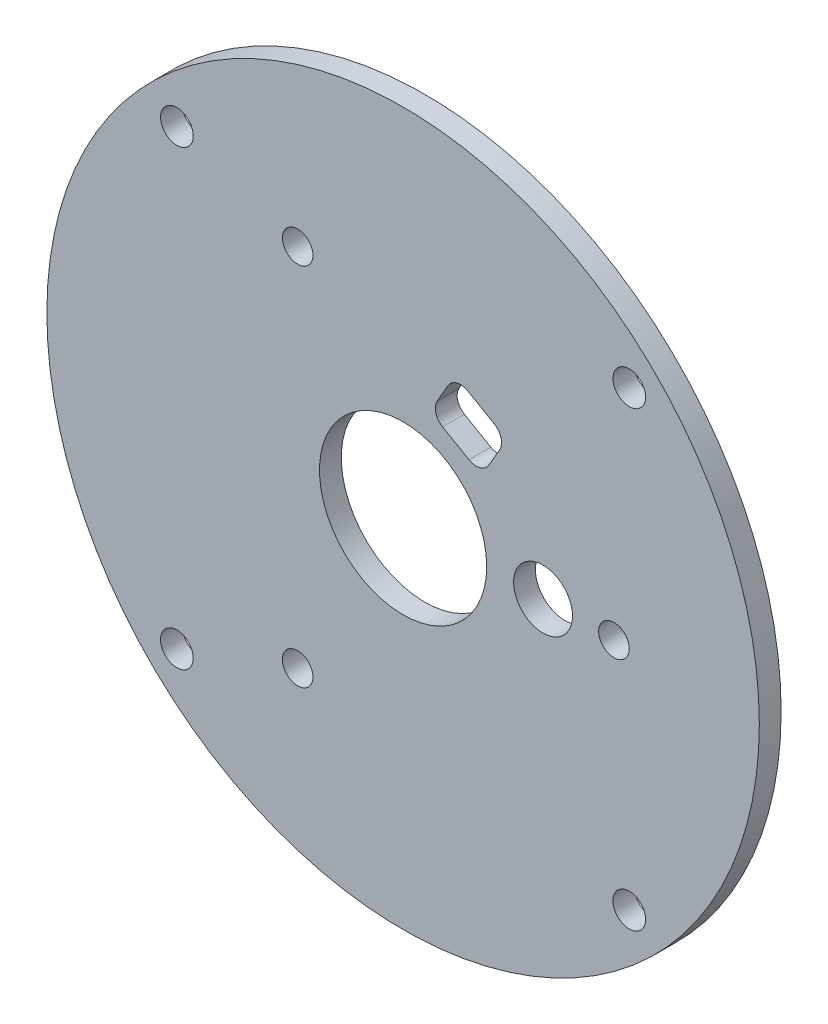
ISO-10303-21;
HEADER;
FILE_DESCRIPTION(('STEP AP214'),'2;1');
FILE_NAME('part.step','',(''),(''),'','','');
FILE_SCHEMA(('AUTOMOTIVE_DESIGN { 1 0 10303 214 1 1 1 1 }'));
ENDSEC;
DATA;
#1=APPLICATION_CONTEXT('core data for automotive mechanical design processes');
#2=APPLICATION_PROTOCOL_DEFINITION('international standard','automotive_design',2000,#1);
#3=PRODUCT_CONTEXT('',#1,'mechanical');
#4=PRODUCT('Part','Part','',(#3));
#5=PRODUCT_RELATED_PRODUCT_CATEGORY('part','',(#4));
#6=PRODUCT_DEFINITION_FORMATION('','',#4);
#7=PRODUCT_DEFINITION_CONTEXT('part definition',#1,'design');
#8=PRODUCT_DEFINITION('design','',#6,#7);
#9=PRODUCT_DEFINITION_SHAPE('','',#8);
#10=(LENGTH_UNIT() NAMED_UNIT(*) SI_UNIT(.MILLI.,.METRE.));
#11=(NAMED_UNIT(*) PLANE_ANGLE_UNIT() SI_UNIT($,.RADIAN.));
#12=(NAMED_UNIT(*) SI_UNIT($,.STERADIAN.) SOLID_ANGLE_UNIT());
#13=UNCERTAINTY_MEASURE_WITH_UNIT(LENGTH_MEASURE(1.E-05),#10,'distance_accuracy_value','');
#14=(GEOMETRIC_REPRESENTATION_CONTEXT(3) GLOBAL_UNCERTAINTY_ASSIGNED_CONTEXT((#13)) GLOBAL_UNIT_ASSIGNED_CONTEXT((#10,
#11,#12)) REPRESENTATION_CONTEXT('',''));
#15=CARTESIAN_POINT('',(0.,0.,0.));
#16=DIRECTION('',(0.,0.,1.));
#17=DIRECTION('',(1.,0.,0.));
#18=AXIS2_PLACEMENT_3D('',#15,#16,#17);
#19=CARTESIAN_POINT('',(0.,0.,3.));
#20=DIRECTION('',(0.,0.,-1.));
#21=DIRECTION('',(-1.,0.,0.));
#22=AXIS2_PLACEMENT_3D('',#19,#20,#21);
#23=CYLINDRICAL_SURFACE('',#22,49.);
#24=CARTESIAN_POINT('',(0.,0.,3.));
#25=DIRECTION('',(0.,0.,1.));
#26=DIRECTION('',(1.,0.,0.));
#27=AXIS2_PLACEMENT_3D('',#24,#25,#26);
#28=CIRCLE('',#27,49.);
#29=CARTESIAN_POINT('',(49.,0.,3.));
#30=VERTEX_POINT('',#29);
#31=EDGE_CURVE('E114',#30,#30,#28,.T.);
#32=ORIENTED_EDGE('',*,*,#31,.F.);
#33=EDGE_LOOP('',(#32));
#34=FACE_BOUND('',#33,.T.);
#35=CARTESIAN_POINT('',(0.,0.,0.));
#36=DIRECTION('',(0.,0.,1.));
#37=DIRECTION('',(1.,0.,0.));
#38=AXIS2_PLACEMENT_3D('',#35,#36,#37);
#39=CIRCLE('',#38,49.);
#40=CARTESIAN_POINT('',(49.,0.,0.));
#41=VERTEX_POINT('',#40);
#42=EDGE_CURVE('E175',#41,#41,#39,.T.);
#43=ORIENTED_EDGE('',*,*,#42,.T.);
#44=EDGE_LOOP('',(#43));
#45=FACE_BOUND('',#44,.T.);
#46=ADVANCED_FACE('F36',(#34,#45),#23,.T.);
#47=CARTESIAN_POINT('',(0.,0.,3.));
#48=DIRECTION('',(0.,0.,1.));
#49=DIRECTION('',(1.,0.,0.));
#50=AXIS2_PLACEMENT_3D('',#47,#48,#49);
#51=PLANE('',#50);
#52=CARTESIAN_POINT('',(-31.1126983722071,-31.1126983722073,3.));
#53=DIRECTION('',(0.,0.,1.));
#54=DIRECTION('',(1.,0.,0.));
#55=AXIS2_PLACEMENT_3D('',#52,#53,#54);
#56=CIRCLE('',#55,2.25);
#57=CARTESIAN_POINT('',(-28.8626983722072,-31.1126983722073,3.));
#58=VERTEX_POINT('',#57);
#59=EDGE_CURVE('E228',#58,#58,#56,.T.);
#60=ORIENTED_EDGE('',*,*,#59,.F.);
#61=EDGE_LOOP('',(#60));
#62=FACE_BOUND('',#61,.T.);
#63=CARTESIAN_POINT('',(31.1126983722072,-31.1126983722073,3.));
#64=DIRECTION('',(0.,0.,1.));
#65=DIRECTION('',(1.,0.,0.));
#66=AXIS2_PLACEMENT_3D('',#63,#64,#65);
#67=CIRCLE('',#66,2.25000000000001);
#68=CARTESIAN_POINT('',(33.3626983722072,-31.1126983722073,3.));
#69=VERTEX_POINT('',#68);
#70=EDGE_CURVE('E227',#69,#69,#67,.T.);
#71=ORIENTED_EDGE('',*,*,#70,.F.);
#72=EDGE_LOOP('',(#71));
#73=FACE_BOUND('',#72,.T.);
#74=CARTESIAN_POINT('',(31.1126983722071,31.1126983722073,3.));
#75=DIRECTION('',(0.,0.,1.));
#76=DIRECTION('',(1.,0.,0.));
#77=AXIS2_PLACEMENT_3D('',#74,#75,#76);
#78=CIRCLE('',#77,2.25);
#79=CARTESIAN_POINT('',(33.3626983722071,31.1126983722073,3.));
#80=VERTEX_POINT('',#79);
#81=EDGE_CURVE('E234',#80,#80,#78,.T.);
#82=ORIENTED_EDGE('',*,*,#81,.F.);
#83=EDGE_LOOP('',(#82));
#84=FACE_BOUND('',#83,.T.);
#85=CARTESIAN_POINT('',(-31.1126983722072,31.1126983722073,3.));
#86=DIRECTION('',(0.,0.,1.));
#87=DIRECTION('',(1.,0.,0.));
#88=AXIS2_PLACEMENT_3D('',#85,#86,#87);
#89=CIRCLE('',#88,2.25);
#90=CARTESIAN_POINT('',(-28.8626983722072,31.1126983722073,3.));
#91=VERTEX_POINT('',#90);
#92=EDGE_CURVE('E220',#91,#91,#89,.T.);
#93=ORIENTED_EDGE('',*,*,#92,.F.);
#94=EDGE_LOOP('',(#93));
#95=FACE_BOUND('',#94,.T.);
#96=CARTESIAN_POINT('',(0.,0.,3.));
#97=DIRECTION('',(0.,0.,1.));
#98=DIRECTION('',(1.,0.,0.));
#99=AXIS2_PLACEMENT_3D('',#96,#97,#98);
#100=CIRCLE('',#99,11.5);
#101=CARTESIAN_POINT('',(11.5,0.,3.));
#102=VERTEX_POINT('',#101);
#103=EDGE_CURVE('E168',#102,#102,#100,.F.);
#104=ORIENTED_EDGE('',*,*,#103,.T.);
#105=EDGE_LOOP('',(#104));
#106=FACE_BOUND('',#105,.T.);
#107=DIRECTION('',(-0.500123267776996,-0.865954223402172,0.));
#108=VECTOR('',#107,1.);
#109=CARTESIAN_POINT('',(-3.55041231594891,2.05050539788568,3.));
#110=LINE('',#109,#108);
#111=CARTESIAN_POINT('',(6.17141129111391,18.8836638492554,3.));
#112=VERTEX_POINT('',#111);
#113=CARTESIAN_POINT('',(4.70162160237152,16.3387500840215,3.));
#114=VERTEX_POINT('',#113);
#115=EDGE_CURVE('E204',#112,#114,#110,.T.);
#116=ORIENTED_EDGE('',*,*,#115,.F.);
#117=CARTESIAN_POINT('',(7.90331973791826,17.8834173137014,3.));
#118=DIRECTION('',(0.,0.,1.));
#119=DIRECTION('',(1.,0.,0.));
#120=AXIS2_PLACEMENT_3D('',#117,#118,#119);
#121=CIRCLE('',#120,2.);
#122=CARTESIAN_POINT('',(8.90356627347225,19.6153257605058,3.));
#123=VERTEX_POINT('',#122);
#124=EDGE_CURVE('E122',#112,#123,#121,.F.);
#125=ORIENTED_EDGE('',*,*,#124,.T.);
#126=DIRECTION('',(-0.865954223402173,0.500123267776995,0.));
#127=VECTOR('',#126,1.);
#128=CARTESIAN_POINT('',(10.7220701426168,18.5650668981741,3.));
#129=LINE('',#128,#127);
#130=CARTESIAN_POINT('',(12.5405740117614,17.5148080358424,3.));
#131=VERTEX_POINT('',#130);
#132=EDGE_CURVE('E107',#131,#123,#129,.T.);
#133=ORIENTED_EDGE('',*,*,#132,.F.);
#134=CARTESIAN_POINT('',(11.5403274762074,15.7828995890381,3.));
#135=DIRECTION('',(0.,0.,1.));
#136=DIRECTION('',(1.,0.,0.));
#137=AXIS2_PLACEMENT_3D('',#134,#135,#136);
#138=CIRCLE('',#137,2.);
#139=CARTESIAN_POINT('',(13.2722359230117,14.7826530534841,3.));
#140=VERTEX_POINT('',#139);
#141=EDGE_CURVE('E119',#131,#140,#138,.F.);
#142=ORIENTED_EDGE('',*,*,#141,.T.);
#143=DIRECTION('',(-0.500123267776995,-0.865954223402173,0.));
#144=VECTOR('',#143,1.);
#145=CARTESIAN_POINT('',(3.55041231594891,-2.05050539788568,3.));
#146=LINE('',#145,#144);
#147=CARTESIAN_POINT('',(11.8024462342693,12.2377392882502,3.));
#148=VERTEX_POINT('',#147);
#149=EDGE_CURVE('E123',#140,#148,#146,.T.);
#150=ORIENTED_EDGE('',*,*,#149,.T.);
#151=CARTESIAN_POINT('',(10.070537787465,13.2379858238042,3.));
#152=DIRECTION('',(0.,0.,1.));
#153=DIRECTION('',(1.,0.,0.));
#154=AXIS2_PLACEMENT_3D('',#151,#152,#153);
#155=CIRCLE('',#154,2.);
#156=CARTESIAN_POINT('',(9.070291251911,11.5060773769998,3.));
#157=VERTEX_POINT('',#156);
#158=EDGE_CURVE('E58',#148,#157,#155,.F.);
#159=ORIENTED_EDGE('',*,*,#158,.T.);
#160=DIRECTION('',(-0.865954223402173,0.500123267776995,0.));
#161=VECTOR('',#160,1.);
#162=CARTESIAN_POINT('',(7.25178738276643,12.5563362393315,3.));
#163=LINE('',#162,#161);
#164=CARTESIAN_POINT('',(5.43328351362187,13.6065951016632,3.));
#165=VERTEX_POINT('',#164);
#166=EDGE_CURVE('E206',#157,#165,#163,.T.);
#167=ORIENTED_EDGE('',*,*,#166,.T.);
#168=CARTESIAN_POINT('',(6.43353004917586,15.3385035484675,3.));
#169=DIRECTION('',(0.,0.,1.));
#170=DIRECTION('',(1.,0.,0.));
#171=AXIS2_PLACEMENT_3D('',#168,#169,#170);
#172=CIRCLE('',#171,2.);
#173=EDGE_CURVE('E11',#165,#114,#172,.F.);
#174=ORIENTED_EDGE('',*,*,#173,.T.);
#175=EDGE_LOOP('',(#116,#125,#133,#142,#150,#159,#167,#174));
#176=FACE_BOUND('',#175,.T.);
#177=CARTESIAN_POINT('',(19.25,0.,3.));
#178=DIRECTION('',(0.,0.,1.));
#179=DIRECTION('',(1.,0.,0.));
#180=AXIS2_PLACEMENT_3D('',#177,#178,#179);
#181=CIRCLE('',#180,4.05);
#182=CARTESIAN_POINT('',(23.3,0.,3.));
#183=VERTEX_POINT('',#182);
#184=EDGE_CURVE('E196',#183,#183,#181,.F.);
#185=ORIENTED_EDGE('',*,*,#184,.T.);
#186=EDGE_LOOP('',(#185));
#187=FACE_BOUND('',#186,.T.);
#188=CARTESIAN_POINT('',(-14.5000000000001,25.1147367097487,3.));
#189=DIRECTION('',(0.,0.,1.));
#190=DIRECTION('',(1.,0.,0.));
#191=AXIS2_PLACEMENT_3D('',#188,#189,#190);
#192=CIRCLE('',#191,2.1);
#193=CARTESIAN_POINT('',(-12.4000000000001,25.1147367097487,3.));
#194=VERTEX_POINT('',#193);
#195=EDGE_CURVE('E186',#194,#194,#192,.F.);
#196=ORIENTED_EDGE('',*,*,#195,.T.);
#197=EDGE_LOOP('',(#196));
#198=FACE_BOUND('',#197,.T.);
#199=CARTESIAN_POINT('',(29.,0.,3.));
#200=DIRECTION('',(0.,0.,1.));
#201=DIRECTION('',(1.,0.,0.));
#202=AXIS2_PLACEMENT_3D('',#199,#200,#201);
#203=CIRCLE('',#202,2.1);
#204=CARTESIAN_POINT('',(31.1,0.,3.));
#205=VERTEX_POINT('',#204);
#206=EDGE_CURVE('E183',#205,#205,#203,.F.);
#207=ORIENTED_EDGE('',*,*,#206,.T.);
#208=EDGE_LOOP('',(#207));
#209=FACE_BOUND('',#208,.T.);
#210=CARTESIAN_POINT('',(-14.5,-25.1147367097487,3.));
#211=DIRECTION('',(0.,0.,1.));
#212=DIRECTION('',(1.,0.,0.));
#213=AXIS2_PLACEMENT_3D('',#210,#211,#212);
#214=CIRCLE('',#213,2.1);
#215=CARTESIAN_POINT('',(-12.4,-25.1147367097487,3.));
#216=VERTEX_POINT('',#215);
#217=EDGE_CURVE('E178',#216,#216,#214,.F.);
#218=ORIENTED_EDGE('',*,*,#217,.T.);
#219=EDGE_LOOP('',(#218));
#220=FACE_BOUND('',#219,.T.);
#221=ORIENTED_EDGE('',*,*,#31,.T.);
#222=EDGE_LOOP('',(#221));
#223=FACE_BOUND('',#222,.T.);
#224=ADVANCED_FACE('F117',(#62,#73,#84,#95,#106,#176,#187,#198,#209,#220,#223),#51,.T.);
#225=CARTESIAN_POINT('',(0.,44.,0.));
#226=DIRECTION('',(0.,0.,1.));
#227=DIRECTION('',(1.,0.,0.));
#228=AXIS2_PLACEMENT_3D('',#225,#226,#227);
#229=PLANE('',#228);
#230=CARTESIAN_POINT('',(-31.1126983722071,-31.1126983722073,0.));
#231=DIRECTION('',(0.,0.,1.));
#232=DIRECTION('',(1.,0.,0.));
#233=AXIS2_PLACEMENT_3D('',#230,#231,#232);
#234=CIRCLE('',#233,2.25);
#235=CARTESIAN_POINT('',(-28.8626983722072,-31.1126983722073,0.));
#236=VERTEX_POINT('',#235);
#237=EDGE_CURVE('E224',#236,#236,#234,.F.);
#238=ORIENTED_EDGE('',*,*,#237,.F.);
#239=EDGE_LOOP('',(#238));
#240=FACE_BOUND('',#239,.T.);
#241=CARTESIAN_POINT('',(31.1126983722072,-31.1126983722073,0.));
#242=DIRECTION('',(0.,0.,1.));
#243=DIRECTION('',(1.,0.,0.));
#244=AXIS2_PLACEMENT_3D('',#241,#242,#243);
#245=CIRCLE('',#244,2.25000000000001);
#246=CARTESIAN_POINT('',(33.3626983722072,-31.1126983722073,0.));
#247=VERTEX_POINT('',#246);
#248=EDGE_CURVE('E231',#247,#247,#245,.F.);
#249=ORIENTED_EDGE('',*,*,#248,.F.);
#250=EDGE_LOOP('',(#249));
#251=FACE_BOUND('',#250,.T.);
#252=CARTESIAN_POINT('',(31.1126983722071,31.1126983722073,0.));
#253=DIRECTION('',(0.,0.,1.));
#254=DIRECTION('',(1.,0.,0.));
#255=AXIS2_PLACEMENT_3D('',#252,#253,#254);
#256=CIRCLE('',#255,2.25);
#257=CARTESIAN_POINT('',(33.3626983722071,31.1126983722073,0.));
#258=VERTEX_POINT('',#257);
#259=EDGE_CURVE('E223',#258,#258,#256,.F.);
#260=ORIENTED_EDGE('',*,*,#259,.F.);
#261=EDGE_LOOP('',(#260));
#262=FACE_BOUND('',#261,.T.);
#263=CARTESIAN_POINT('',(-31.1126983722072,31.1126983722073,0.));
#264=DIRECTION('',(0.,0.,1.));
#265=DIRECTION('',(1.,0.,0.));
#266=AXIS2_PLACEMENT_3D('',#263,#264,#265);
#267=CIRCLE('',#266,2.25);
#268=CARTESIAN_POINT('',(-28.8626983722072,31.1126983722073,0.));
#269=VERTEX_POINT('',#268);
#270=EDGE_CURVE('E217',#269,#269,#267,.F.);
#271=ORIENTED_EDGE('',*,*,#270,.F.);
#272=EDGE_LOOP('',(#271));
#273=FACE_BOUND('',#272,.T.);
#274=CARTESIAN_POINT('',(0.,0.,0.));
#275=DIRECTION('',(0.,0.,1.));
#276=DIRECTION('',(1.,0.,0.));
#277=AXIS2_PLACEMENT_3D('',#274,#275,#276);
#278=CIRCLE('',#277,11.5);
#279=CARTESIAN_POINT('',(11.5,0.,0.));
#280=VERTEX_POINT('',#279);
#281=EDGE_CURVE('E214',#280,#280,#278,.T.);
#282=ORIENTED_EDGE('',*,*,#281,.T.);
#283=EDGE_LOOP('',(#282));
#284=FACE_BOUND('',#283,.T.);
#285=DIRECTION('',(0.865954223402173,-0.500123267776995,0.));
#286=VECTOR('',#285,1.);
#287=CARTESIAN_POINT('',(7.1716578266679,20.6155722960598,0.));
#288=LINE('',#287,#286);
#289=CARTESIAN_POINT('',(8.90356627347225,19.6153257605058,0.));
#290=VERTEX_POINT('',#289);
#291=CARTESIAN_POINT('',(12.5405740117614,17.5148080358424,0.));
#292=VERTEX_POINT('',#291);
#293=EDGE_CURVE('E110',#290,#292,#288,.T.);
#294=ORIENTED_EDGE('',*,*,#293,.F.);
#295=CARTESIAN_POINT('',(7.90331973791826,17.8834173137014,0.));
#296=DIRECTION('',(0.,0.,1.));
#297=DIRECTION('',(1.,0.,0.));
#298=AXIS2_PLACEMENT_3D('',#295,#296,#297);
#299=CIRCLE('',#298,2.);
#300=CARTESIAN_POINT('',(6.17141129111391,18.8836638492554,0.));
#301=VERTEX_POINT('',#300);
#302=EDGE_CURVE('E155',#290,#301,#299,.T.);
#303=ORIENTED_EDGE('',*,*,#302,.T.);
#304=DIRECTION('',(0.500123267776996,0.865954223402172,0.));
#305=VECTOR('',#304,1.);
#306=CARTESIAN_POINT('',(3.70137506681753,14.6068416372172,0.));
#307=LINE('',#306,#305);
#308=CARTESIAN_POINT('',(4.70162160237152,16.3387500840215,0.));
#309=VERTEX_POINT('',#308);
#310=EDGE_CURVE('E143',#309,#301,#307,.T.);
#311=ORIENTED_EDGE('',*,*,#310,.F.);
#312=CARTESIAN_POINT('',(6.43353004917586,15.3385035484675,0.));
#313=DIRECTION('',(0.,0.,1.));
#314=DIRECTION('',(1.,0.,0.));
#315=AXIS2_PLACEMENT_3D('',#312,#313,#314);
#316=CIRCLE('',#315,2.);
#317=CARTESIAN_POINT('',(5.43328351362187,13.6065951016632,0.));
#318=VERTEX_POINT('',#317);
#319=EDGE_CURVE('E44',#309,#318,#316,.T.);
#320=ORIENTED_EDGE('',*,*,#319,.T.);
#321=DIRECTION('',(0.865954223402172,-0.500123267776995,0.));
#322=VECTOR('',#321,1.);
#323=CARTESIAN_POINT('',(3.70137506681753,14.6068416372172,0.));
#324=LINE('',#323,#322);
#325=CARTESIAN_POINT('',(9.070291251911,11.5060773769998,0.));
#326=VERTEX_POINT('',#325);
#327=EDGE_CURVE('E124',#318,#326,#324,.T.);
#328=ORIENTED_EDGE('',*,*,#327,.T.);
#329=CARTESIAN_POINT('',(10.070537787465,13.2379858238042,0.));
#330=DIRECTION('',(0.,0.,1.));
#331=DIRECTION('',(1.,0.,0.));
#332=AXIS2_PLACEMENT_3D('',#329,#330,#331);
#333=CIRCLE('',#332,2.);
#334=CARTESIAN_POINT('',(11.8024462342693,12.2377392882502,0.));
#335=VERTEX_POINT('',#334);
#336=EDGE_CURVE('E130',#326,#335,#333,.T.);
#337=ORIENTED_EDGE('',*,*,#336,.T.);
#338=DIRECTION('',(0.500123267776995,0.865954223402173,0.));
#339=VECTOR('',#338,1.);
#340=CARTESIAN_POINT('',(10.8021996987153,10.5058308414458,0.));
#341=LINE('',#340,#339);
#342=CARTESIAN_POINT('',(13.2722359230117,14.7826530534841,0.));
#343=VERTEX_POINT('',#342);
#344=EDGE_CURVE('E151',#335,#343,#341,.T.);
#345=ORIENTED_EDGE('',*,*,#344,.T.);
#346=CARTESIAN_POINT('',(11.5403274762074,15.7828995890381,0.));
#347=DIRECTION('',(0.,0.,1.));
#348=DIRECTION('',(1.,0.,0.));
#349=AXIS2_PLACEMENT_3D('',#346,#347,#348);
#350=CIRCLE('',#349,2.);
#351=EDGE_CURVE('E131',#343,#292,#350,.T.);
#352=ORIENTED_EDGE('',*,*,#351,.T.);
#353=EDGE_LOOP('',(#294,#303,#311,#320,#328,#337,#345,#352));
#354=FACE_BOUND('',#353,.T.);
#355=CARTESIAN_POINT('',(19.25,0.,0.));
#356=DIRECTION('',(0.,0.,1.));
#357=DIRECTION('',(1.,0.,0.));
#358=AXIS2_PLACEMENT_3D('',#355,#356,#357);
#359=CIRCLE('',#358,4.05);
#360=CARTESIAN_POINT('',(23.3,0.,0.));
#361=VERTEX_POINT('',#360);
#362=EDGE_CURVE('E201',#361,#361,#359,.T.);
#363=ORIENTED_EDGE('',*,*,#362,.T.);
#364=EDGE_LOOP('',(#363));
#365=FACE_BOUND('',#364,.T.);
#366=CARTESIAN_POINT('',(29.,0.,0.));
#367=DIRECTION('',(0.,0.,1.));
#368=DIRECTION('',(1.,0.,0.));
#369=AXIS2_PLACEMENT_3D('',#366,#367,#368);
#370=CIRCLE('',#369,2.1);
#371=CARTESIAN_POINT('',(31.1,0.,0.));
#372=VERTEX_POINT('',#371);
#373=EDGE_CURVE('E193',#372,#372,#370,.T.);
#374=ORIENTED_EDGE('',*,*,#373,.T.);
#375=EDGE_LOOP('',(#374));
#376=FACE_BOUND('',#375,.T.);
#377=CARTESIAN_POINT('',(-14.5,-25.1147367097487,0.));
#378=DIRECTION('',(0.,0.,1.));
#379=DIRECTION('',(1.,0.,0.));
#380=AXIS2_PLACEMENT_3D('',#377,#378,#379);
#381=CIRCLE('',#380,2.1);
#382=CARTESIAN_POINT('',(-12.4,-25.1147367097487,0.));
#383=VERTEX_POINT('',#382);
#384=EDGE_CURVE('E192',#383,#383,#381,.T.);
#385=ORIENTED_EDGE('',*,*,#384,.T.);
#386=EDGE_LOOP('',(#385));
#387=FACE_BOUND('',#386,.T.);
#388=CARTESIAN_POINT('',(-14.5000000000001,25.1147367097487,0.));
#389=DIRECTION('',(0.,0.,1.));
#390=DIRECTION('',(1.,0.,0.));
#391=AXIS2_PLACEMENT_3D('',#388,#389,#390);
#392=CIRCLE('',#391,2.1);
#393=CARTESIAN_POINT('',(-12.4000000000001,25.1147367097487,0.));
#394=VERTEX_POINT('',#393);
#395=EDGE_CURVE('E189',#394,#394,#392,.T.);
#396=ORIENTED_EDGE('',*,*,#395,.T.);
#397=EDGE_LOOP('',(#396));
#398=FACE_BOUND('',#397,.T.);
#399=ORIENTED_EDGE('',*,*,#42,.F.);
#400=EDGE_LOOP('',(#399));
#401=FACE_BOUND('',#400,.T.);
#402=ADVANCED_FACE('F140',(#240,#251,#262,#273,#284,#354,#365,#376,#387,#398,#401),#229,.F.);
#403=CARTESIAN_POINT('',(-14.5000000000001,25.1147367097487,13.));
#404=DIRECTION('',(0.,0.,-1.));
#405=DIRECTION('',(-1.,0.,0.));
#406=AXIS2_PLACEMENT_3D('',#403,#404,#405);
#407=CYLINDRICAL_SURFACE('',#406,2.1);
#408=ORIENTED_EDGE('',*,*,#195,.F.);
#409=EDGE_LOOP('',(#408));
#410=FACE_BOUND('',#409,.T.);
#411=ORIENTED_EDGE('',*,*,#395,.F.);
#412=EDGE_LOOP('',(#411));
#413=FACE_BOUND('',#412,.T.);
#414=ADVANCED_FACE('F260',(#410,#413),#407,.F.);
#415=CARTESIAN_POINT('',(-14.5,-25.1147367097487,13.));
#416=DIRECTION('',(0.,0.,-1.));
#417=DIRECTION('',(-1.,0.,0.));
#418=AXIS2_PLACEMENT_3D('',#415,#416,#417);
#419=CYLINDRICAL_SURFACE('',#418,2.1);
#420=ORIENTED_EDGE('',*,*,#217,.F.);
#421=EDGE_LOOP('',(#420));
#422=FACE_BOUND('',#421,.T.);
#423=ORIENTED_EDGE('',*,*,#384,.F.);
#424=EDGE_LOOP('',(#423));
#425=FACE_BOUND('',#424,.T.);
#426=ADVANCED_FACE('F266',(#422,#425),#419,.F.);
#427=CARTESIAN_POINT('',(29.,0.,13.));
#428=DIRECTION('',(0.,0.,-1.));
#429=DIRECTION('',(-1.,0.,0.));
#430=AXIS2_PLACEMENT_3D('',#427,#428,#429);
#431=CYLINDRICAL_SURFACE('',#430,2.1);
#432=ORIENTED_EDGE('',*,*,#206,.F.);
#433=EDGE_LOOP('',(#432));
#434=FACE_BOUND('',#433,.T.);
#435=ORIENTED_EDGE('',*,*,#373,.F.);
#436=EDGE_LOOP('',(#435));
#437=FACE_BOUND('',#436,.T.);
#438=ADVANCED_FACE('F280',(#434,#437),#431,.F.);
#439=CARTESIAN_POINT('',(19.25,0.,13.));
#440=DIRECTION('',(0.,0.,-1.));
#441=DIRECTION('',(-1.,0.,0.));
#442=AXIS2_PLACEMENT_3D('',#439,#440,#441);
#443=CYLINDRICAL_SURFACE('',#442,4.05);
#444=ORIENTED_EDGE('',*,*,#184,.F.);
#445=EDGE_LOOP('',(#444));
#446=FACE_BOUND('',#445,.T.);
#447=ORIENTED_EDGE('',*,*,#362,.F.);
#448=EDGE_LOOP('',(#447));
#449=FACE_BOUND('',#448,.T.);
#450=ADVANCED_FACE('F283',(#446,#449),#443,.F.);
#451=CARTESIAN_POINT('',(3.70137506681753,14.6068416372172,13.));
#452=DIRECTION('',(-0.865954223402173,0.500123267776996,0.));
#453=DIRECTION('',(-0.500123267776996,-0.865954223402172,0.));
#454=AXIS2_PLACEMENT_3D('',#451,#452,#453);
#455=PLANE('',#454);
#456=ORIENTED_EDGE('',*,*,#310,.T.);
#457=DIRECTION('',(0.,0.,-1.));
#458=VECTOR('',#457,1.);
#459=CARTESIAN_POINT('',(6.17141129111391,18.8836638492554,3.));
#460=LINE('',#459,#458);
#461=EDGE_CURVE('E166',#301,#112,#460,.F.);
#462=ORIENTED_EDGE('',*,*,#461,.T.);
#463=ORIENTED_EDGE('',*,*,#115,.T.);
#464=DIRECTION('',(0.,0.,-1.));
#465=VECTOR('',#464,1.);
#466=CARTESIAN_POINT('',(4.70162160237152,16.3387500840215,13.));
#467=LINE('',#466,#465);
#468=EDGE_CURVE('E167',#114,#309,#467,.T.);
#469=ORIENTED_EDGE('',*,*,#468,.T.);
#470=EDGE_LOOP('',(#456,#462,#463,#469));
#471=FACE_BOUND('',#470,.T.);
#472=ADVANCED_FACE('F164',(#471),#455,.F.);
#473=CARTESIAN_POINT('',(3.70137506681753,14.6068416372172,13.));
#474=DIRECTION('',(0.500123267776995,0.865954223402173,0.));
#475=DIRECTION('',(-0.865954223402173,0.500123267776995,0.));
#476=AXIS2_PLACEMENT_3D('',#473,#474,#475);
#477=PLANE('',#476);
#478=ORIENTED_EDGE('',*,*,#166,.F.);
#479=DIRECTION('',(0.,0.,-1.));
#480=VECTOR('',#479,1.);
#481=CARTESIAN_POINT('',(9.070291251911,11.5060773769998,0.));
#482=LINE('',#481,#480);
#483=EDGE_CURVE('E150',#157,#326,#482,.T.);
#484=ORIENTED_EDGE('',*,*,#483,.T.);
#485=ORIENTED_EDGE('',*,*,#327,.F.);
#486=DIRECTION('',(0.,0.,-1.));
#487=VECTOR('',#486,1.);
#488=CARTESIAN_POINT('',(5.43328351362187,13.6065951016632,13.));
#489=LINE('',#488,#487);
#490=EDGE_CURVE('E51',#318,#165,#489,.F.);
#491=ORIENTED_EDGE('',*,*,#490,.T.);
#492=EDGE_LOOP('',(#478,#484,#485,#491));
#493=FACE_BOUND('',#492,.T.);
#494=ADVANCED_FACE('F148',(#493),#477,.T.);
#495=CARTESIAN_POINT('',(10.8021996987153,10.5058308414458,13.));
#496=DIRECTION('',(-0.865954223402173,0.500123267776995,0.));
#497=DIRECTION('',(-0.500123267776995,-0.865954223402173,0.));
#498=AXIS2_PLACEMENT_3D('',#495,#496,#497);
#499=PLANE('',#498);
#500=ORIENTED_EDGE('',*,*,#149,.F.);
#501=DIRECTION('',(0.,0.,-1.));
#502=VECTOR('',#501,1.);
#503=CARTESIAN_POINT('',(13.2722359230117,14.7826530534841,13.));
#504=LINE('',#503,#502);
#505=EDGE_CURVE('E129',#140,#343,#504,.T.);
#506=ORIENTED_EDGE('',*,*,#505,.T.);
#507=ORIENTED_EDGE('',*,*,#344,.F.);
#508=DIRECTION('',(0.,0.,-1.));
#509=VECTOR('',#508,1.);
#510=CARTESIAN_POINT('',(11.8024462342693,12.2377392882502,3.));
#511=LINE('',#510,#509);
#512=EDGE_CURVE('E157',#335,#148,#511,.F.);
#513=ORIENTED_EDGE('',*,*,#512,.T.);
#514=EDGE_LOOP('',(#500,#506,#507,#513));
#515=FACE_BOUND('',#514,.T.);
#516=ADVANCED_FACE('F295',(#515),#499,.T.);
#517=CARTESIAN_POINT('',(7.1716578266679,20.6155722960598,13.));
#518=DIRECTION('',(0.500123267776995,0.865954223402173,0.));
#519=DIRECTION('',(-0.865954223402173,0.500123267776995,0.));
#520=AXIS2_PLACEMENT_3D('',#517,#518,#519);
#521=PLANE('',#520);
#522=ORIENTED_EDGE('',*,*,#132,.T.);
#523=DIRECTION('',(0.,0.,-1.));
#524=VECTOR('',#523,1.);
#525=CARTESIAN_POINT('',(8.90356627347225,19.6153257605058,0.));
#526=LINE('',#525,#524);
#527=EDGE_CURVE('E113',#123,#290,#526,.T.);
#528=ORIENTED_EDGE('',*,*,#527,.T.);
#529=ORIENTED_EDGE('',*,*,#293,.T.);
#530=DIRECTION('',(0.,0.,-1.));
#531=VECTOR('',#530,1.);
#532=CARTESIAN_POINT('',(12.5405740117614,17.5148080358424,13.));
#533=LINE('',#532,#531);
#534=EDGE_CURVE('E103',#292,#131,#533,.F.);
#535=ORIENTED_EDGE('',*,*,#534,.T.);
#536=EDGE_LOOP('',(#522,#528,#529,#535));
#537=FACE_BOUND('',#536,.T.);
#538=ADVANCED_FACE('F105',(#537),#521,.F.);
#539=CARTESIAN_POINT('',(0.,0.,13.));
#540=DIRECTION('',(0.,0.,-1.));
#541=DIRECTION('',(-1.,0.,0.));
#542=AXIS2_PLACEMENT_3D('',#539,#540,#541);
#543=CYLINDRICAL_SURFACE('',#542,11.5);
#544=ORIENTED_EDGE('',*,*,#103,.F.);
#545=EDGE_LOOP('',(#544));
#546=FACE_BOUND('',#545,.T.);
#547=ORIENTED_EDGE('',*,*,#281,.F.);
#548=EDGE_LOOP('',(#547));
#549=FACE_BOUND('',#548,.T.);
#550=ADVANCED_FACE('F253',(#546,#549),#543,.F.);
#551=CARTESIAN_POINT('',(7.90331973791826,17.8834173137014,13.));
#552=DIRECTION('',(0.,0.,1.));
#553=DIRECTION('',(1.,0.,0.));
#554=AXIS2_PLACEMENT_3D('',#551,#552,#553);
#555=CYLINDRICAL_SURFACE('',#554,2.);
#556=ORIENTED_EDGE('',*,*,#124,.F.);
#557=ORIENTED_EDGE('',*,*,#461,.F.);
#558=ORIENTED_EDGE('',*,*,#302,.F.);
#559=ORIENTED_EDGE('',*,*,#527,.F.);
#560=EDGE_LOOP('',(#556,#557,#558,#559));
#561=FACE_BOUND('',#560,.T.);
#562=ADVANCED_FACE('F170',(#561),#555,.F.);
#563=CARTESIAN_POINT('',(11.5403274762074,15.7828995890381,13.));
#564=DIRECTION('',(0.,0.,-1.));
#565=DIRECTION('',(-1.,0.,0.));
#566=AXIS2_PLACEMENT_3D('',#563,#564,#565);
#567=CYLINDRICAL_SURFACE('',#566,2.);
#568=ORIENTED_EDGE('',*,*,#141,.F.);
#569=ORIENTED_EDGE('',*,*,#534,.F.);
#570=ORIENTED_EDGE('',*,*,#351,.F.);
#571=ORIENTED_EDGE('',*,*,#505,.F.);
#572=EDGE_LOOP('',(#568,#569,#570,#571));
#573=FACE_BOUND('',#572,.T.);
#574=ADVANCED_FACE('F127',(#573),#567,.F.);
#575=CARTESIAN_POINT('',(10.070537787465,13.2379858238042,13.));
#576=DIRECTION('',(0.,0.,1.));
#577=DIRECTION('',(1.,0.,0.));
#578=AXIS2_PLACEMENT_3D('',#575,#576,#577);
#579=CYLINDRICAL_SURFACE('',#578,2.);
#580=ORIENTED_EDGE('',*,*,#158,.F.);
#581=ORIENTED_EDGE('',*,*,#512,.F.);
#582=ORIENTED_EDGE('',*,*,#336,.F.);
#583=ORIENTED_EDGE('',*,*,#483,.F.);
#584=EDGE_LOOP('',(#580,#581,#582,#583));
#585=FACE_BOUND('',#584,.T.);
#586=ADVANCED_FACE('F419',(#585),#579,.F.);
#587=CARTESIAN_POINT('',(6.43353004917586,15.3385035484675,13.));
#588=DIRECTION('',(0.,0.,-1.));
#589=DIRECTION('',(-1.,0.,0.));
#590=AXIS2_PLACEMENT_3D('',#587,#588,#589);
#591=CYLINDRICAL_SURFACE('',#590,2.);
#592=ORIENTED_EDGE('',*,*,#173,.F.);
#593=ORIENTED_EDGE('',*,*,#490,.F.);
#594=ORIENTED_EDGE('',*,*,#319,.F.);
#595=ORIENTED_EDGE('',*,*,#468,.F.);
#596=EDGE_LOOP('',(#592,#593,#594,#595));
#597=FACE_BOUND('',#596,.T.);
#598=ADVANCED_FACE('F38',(#597),#591,.F.);
#599=CARTESIAN_POINT('',(-31.1126983722072,31.1126983722073,-0.00100000000000013));
#600=DIRECTION('',(0.,0.,1.));
#601=DIRECTION('',(1.,0.,0.));
#602=AXIS2_PLACEMENT_3D('',#599,#600,#601);
#603=CYLINDRICAL_SURFACE('',#602,2.25);
#604=ORIENTED_EDGE('',*,*,#92,.T.);
#605=EDGE_LOOP('',(#604));
#606=FACE_BOUND('',#605,.T.);
#607=ORIENTED_EDGE('',*,*,#270,.T.);
#608=EDGE_LOOP('',(#607));
#609=FACE_BOUND('',#608,.T.);
#610=ADVANCED_FACE('F301',(#606,#609),#603,.F.);
#611=CARTESIAN_POINT('',(31.1126983722071,31.1126983722073,-0.00100000000000013));
#612=DIRECTION('',(0.,0.,1.));
#613=DIRECTION('',(1.,0.,0.));
#614=AXIS2_PLACEMENT_3D('',#611,#612,#613);
#615=CYLINDRICAL_SURFACE('',#614,2.25);
#616=ORIENTED_EDGE('',*,*,#81,.T.);
#617=EDGE_LOOP('',(#616));
#618=FACE_BOUND('',#617,.T.);
#619=ORIENTED_EDGE('',*,*,#259,.T.);
#620=EDGE_LOOP('',(#619));
#621=FACE_BOUND('',#620,.T.);
#622=ADVANCED_FACE('F242',(#618,#621),#615,.F.);
#623=CARTESIAN_POINT('',(31.1126983722072,-31.1126983722073,-0.00100000000000013));
#624=DIRECTION('',(0.,0.,1.));
#625=DIRECTION('',(1.,0.,0.));
#626=AXIS2_PLACEMENT_3D('',#623,#624,#625);
#627=CYLINDRICAL_SURFACE('',#626,2.25000000000001);
#628=ORIENTED_EDGE('',*,*,#70,.T.);
#629=EDGE_LOOP('',(#628));
#630=FACE_BOUND('',#629,.T.);
#631=ORIENTED_EDGE('',*,*,#248,.T.);
#632=EDGE_LOOP('',(#631));
#633=FACE_BOUND('',#632,.T.);
#634=ADVANCED_FACE('F308',(#630,#633),#627,.F.);
#635=CARTESIAN_POINT('',(-31.1126983722071,-31.1126983722073,-0.00100000000000013));
#636=DIRECTION('',(0.,0.,1.));
#637=DIRECTION('',(1.,0.,0.));
#638=AXIS2_PLACEMENT_3D('',#635,#636,#637);
#639=CYLINDRICAL_SURFACE('',#638,2.25);
#640=ORIENTED_EDGE('',*,*,#59,.T.);
#641=EDGE_LOOP('',(#640));
#642=FACE_BOUND('',#641,.T.);
#643=ORIENTED_EDGE('',*,*,#237,.T.);
#644=EDGE_LOOP('',(#643));
#645=FACE_BOUND('',#644,.T.);
#646=ADVANCED_FACE('F305',(#642,#645),#639,.F.);
#647=CLOSED_SHELL('',(#46,#224,#402,#414,#426,#438,#450,#472,#494,#516,#538,#550,#562,#574,#586,
#598,#610,#622,#634,#646));
#648=MANIFOLD_SOLID_BREP('B2',#647);
#649=ADVANCED_BREP_SHAPE_REPRESENTATION('',(#18,#648),#14);
#650=SHAPE_DEFINITION_REPRESENTATION(#9,#649);
ENDSEC;
END-ISO-10303-21;
